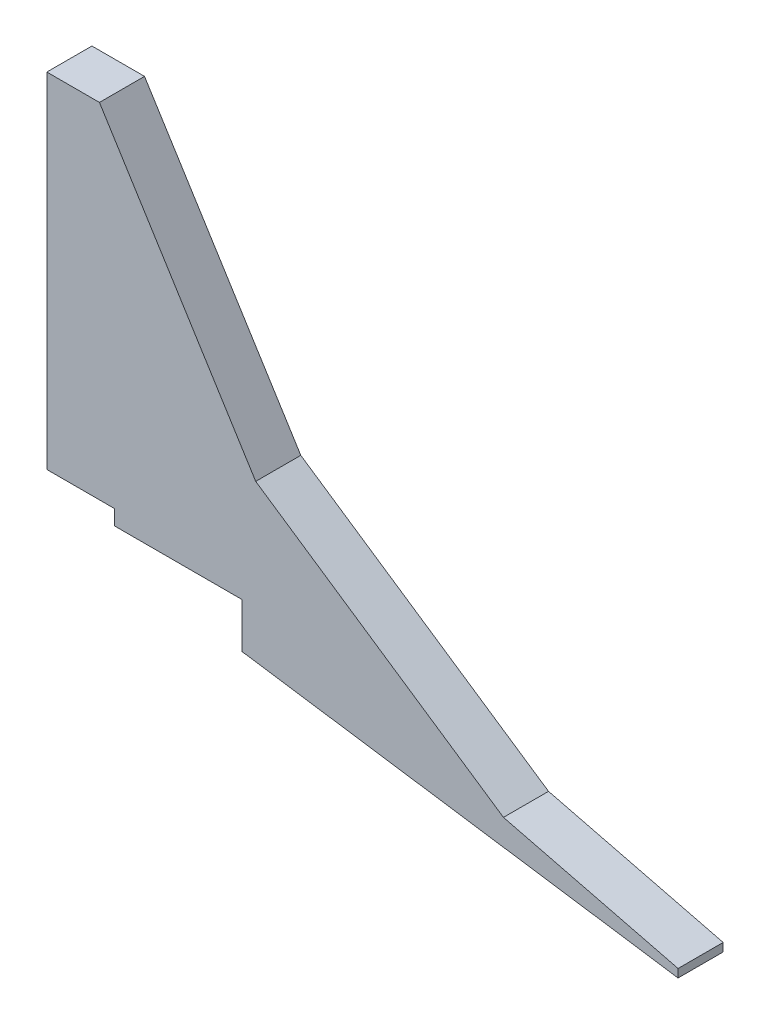
ISO-10303-21;
HEADER;
FILE_DESCRIPTION(('STEP AP214'),'2;1');
FILE_NAME('part.step','',(''),(''),'','','');
FILE_SCHEMA(('AUTOMOTIVE_DESIGN { 1 0 10303 214 1 1 1 1 }'));
ENDSEC;
DATA;
#1=APPLICATION_CONTEXT('core data for automotive mechanical design processes');
#2=APPLICATION_PROTOCOL_DEFINITION('international standard','automotive_design',2000,#1);
#3=PRODUCT_CONTEXT('',#1,'mechanical');
#4=PRODUCT('Part','Part','',(#3));
#5=PRODUCT_RELATED_PRODUCT_CATEGORY('part','',(#4));
#6=PRODUCT_DEFINITION_FORMATION('','',#4);
#7=PRODUCT_DEFINITION_CONTEXT('part definition',#1,'design');
#8=PRODUCT_DEFINITION('design','',#6,#7);
#9=PRODUCT_DEFINITION_SHAPE('','',#8);
#10=(LENGTH_UNIT() NAMED_UNIT(*) SI_UNIT(.MILLI.,.METRE.));
#11=(NAMED_UNIT(*) PLANE_ANGLE_UNIT() SI_UNIT($,.RADIAN.));
#12=(NAMED_UNIT(*) SI_UNIT($,.STERADIAN.) SOLID_ANGLE_UNIT());
#13=UNCERTAINTY_MEASURE_WITH_UNIT(LENGTH_MEASURE(1.E-05),#10,'distance_accuracy_value','');
#14=(GEOMETRIC_REPRESENTATION_CONTEXT(3) GLOBAL_UNCERTAINTY_ASSIGNED_CONTEXT((#13)) GLOBAL_UNIT_ASSIGNED_CONTEXT((#10,
#11,#12)) REPRESENTATION_CONTEXT('',''));
#15=CARTESIAN_POINT('',(0.,0.,0.));
#16=DIRECTION('',(0.,0.,1.));
#17=DIRECTION('',(1.,0.,0.));
#18=AXIS2_PLACEMENT_3D('',#15,#16,#17);
#19=CARTESIAN_POINT('',(94.5,11.,3.));
#20=DIRECTION('',(1.,0.,0.));
#21=DIRECTION('',(0.,0.,-1.));
#22=AXIS2_PLACEMENT_3D('',#19,#20,#21);
#23=PLANE('',#22);
#24=DIRECTION('',(0.,-1.,0.));
#25=VECTOR('',#24,1.);
#26=CARTESIAN_POINT('',(94.5,11.,0.));
#27=LINE('',#26,#25);
#28=CARTESIAN_POINT('',(94.5,11.,0.));
#29=VERTEX_POINT('',#28);
#30=CARTESIAN_POINT('',(94.5,10.,0.));
#31=VERTEX_POINT('',#30);
#32=EDGE_CURVE('E166',#29,#31,#27,.T.);
#33=ORIENTED_EDGE('',*,*,#32,.T.);
#34=DIRECTION('',(0.,0.,-1.));
#35=VECTOR('',#34,1.);
#36=CARTESIAN_POINT('',(94.5,10.,3.));
#37=LINE('',#36,#35);
#38=CARTESIAN_POINT('',(94.5,10.,3.));
#39=VERTEX_POINT('',#38);
#40=EDGE_CURVE('E11',#39,#31,#37,.T.);
#41=ORIENTED_EDGE('',*,*,#40,.F.);
#42=DIRECTION('',(0.,-1.,0.));
#43=VECTOR('',#42,1.);
#44=CARTESIAN_POINT('',(94.5,11.,3.));
#45=LINE('',#44,#43);
#46=CARTESIAN_POINT('',(94.5,11.,3.));
#47=VERTEX_POINT('',#46);
#48=EDGE_CURVE('E196',#47,#39,#45,.T.);
#49=ORIENTED_EDGE('',*,*,#48,.F.);
#50=DIRECTION('',(0.,0.,-1.));
#51=VECTOR('',#50,1.);
#52=CARTESIAN_POINT('',(94.5,11.,3.));
#53=LINE('',#52,#51);
#54=EDGE_CURVE('E162',#47,#29,#53,.T.);
#55=ORIENTED_EDGE('',*,*,#54,.T.);
#56=EDGE_LOOP('',(#33,#41,#49,#55));
#57=FACE_BOUND('',#56,.T.);
#58=ADVANCED_FACE('F45',(#57),#23,.F.);
#59=CARTESIAN_POINT('',(94.5,10.,3.));
#60=DIRECTION('',(0.,1.,0.));
#61=DIRECTION('',(0.,0.,1.));
#62=AXIS2_PLACEMENT_3D('',#59,#60,#61);
#63=PLANE('',#62);
#64=DIRECTION('',(1.,0.,0.));
#65=VECTOR('',#64,1.);
#66=CARTESIAN_POINT('',(94.5,10.,0.));
#67=LINE('',#66,#65);
#68=CARTESIAN_POINT('',(103.,10.,0.));
#69=VERTEX_POINT('',#68);
#70=EDGE_CURVE('E170',#31,#69,#67,.T.);
#71=ORIENTED_EDGE('',*,*,#70,.T.);
#72=DIRECTION('',(0.,0.,-1.));
#73=VECTOR('',#72,1.);
#74=CARTESIAN_POINT('',(103.,10.,3.));
#75=LINE('',#74,#73);
#76=CARTESIAN_POINT('',(103.,10.,3.));
#77=VERTEX_POINT('',#76);
#78=EDGE_CURVE('E54',#77,#69,#75,.T.);
#79=ORIENTED_EDGE('',*,*,#78,.F.);
#80=DIRECTION('',(1.,0.,0.));
#81=VECTOR('',#80,1.);
#82=CARTESIAN_POINT('',(94.5,10.,3.));
#83=LINE('',#82,#81);
#84=EDGE_CURVE('E114',#39,#77,#83,.T.);
#85=ORIENTED_EDGE('',*,*,#84,.F.);
#86=ORIENTED_EDGE('',*,*,#40,.T.);
#87=EDGE_LOOP('',(#71,#79,#85,#86));
#88=FACE_BOUND('',#87,.T.);
#89=ADVANCED_FACE('F281',(#88),#63,.F.);
#90=CARTESIAN_POINT('',(103.,10.,3.));
#91=DIRECTION('',(1.,0.,0.));
#92=DIRECTION('',(0.,0.,-1.));
#93=AXIS2_PLACEMENT_3D('',#90,#91,#92);
#94=PLANE('',#93);
#95=DIRECTION('',(0.,-1.,0.));
#96=VECTOR('',#95,1.);
#97=CARTESIAN_POINT('',(103.,10.,0.));
#98=LINE('',#97,#96);
#99=CARTESIAN_POINT('',(103.,7.,0.));
#100=VERTEX_POINT('',#99);
#101=EDGE_CURVE('E173',#69,#100,#98,.T.);
#102=ORIENTED_EDGE('',*,*,#101,.T.);
#103=DIRECTION('',(0.,0.,-1.));
#104=VECTOR('',#103,1.);
#105=CARTESIAN_POINT('',(103.,7.,3.));
#106=LINE('',#105,#104);
#107=CARTESIAN_POINT('',(103.,7.,3.));
#108=VERTEX_POINT('',#107);
#109=EDGE_CURVE('E219',#108,#100,#106,.T.);
#110=ORIENTED_EDGE('',*,*,#109,.F.);
#111=DIRECTION('',(0.,-1.,0.));
#112=VECTOR('',#111,1.);
#113=CARTESIAN_POINT('',(103.,10.,3.));
#114=LINE('',#113,#112);
#115=EDGE_CURVE('E229',#77,#108,#114,.T.);
#116=ORIENTED_EDGE('',*,*,#115,.F.);
#117=ORIENTED_EDGE('',*,*,#78,.T.);
#118=EDGE_LOOP('',(#102,#110,#116,#117));
#119=FACE_BOUND('',#118,.T.);
#120=ADVANCED_FACE('F227',(#119),#94,.F.);
#121=CARTESIAN_POINT('',(103.,7.,3.));
#122=DIRECTION('',(0.14667227947207,0.989185140625589,0.));
#123=DIRECTION('',(-0.989185140625589,0.14667227947207,0.));
#124=AXIS2_PLACEMENT_3D('',#121,#122,#123);
#125=PLANE('',#124);
#126=DIRECTION('',(0.989185140625589,-0.14667227947207,0.));
#127=VECTOR('',#126,1.);
#128=CARTESIAN_POINT('',(103.,7.,0.));
#129=LINE('',#128,#127);
#130=CARTESIAN_POINT('',(132.,2.7,0.));
#131=VERTEX_POINT('',#130);
#132=EDGE_CURVE('E176',#100,#131,#129,.T.);
#133=ORIENTED_EDGE('',*,*,#132,.T.);
#134=DIRECTION('',(0.,0.,-1.));
#135=VECTOR('',#134,1.);
#136=CARTESIAN_POINT('',(132.,2.7,3.));
#137=LINE('',#136,#135);
#138=CARTESIAN_POINT('',(132.,2.7,3.));
#139=VERTEX_POINT('',#138);
#140=EDGE_CURVE('E215',#139,#131,#137,.T.);
#141=ORIENTED_EDGE('',*,*,#140,.F.);
#142=DIRECTION('',(0.989185140625589,-0.14667227947207,0.));
#143=VECTOR('',#142,1.);
#144=CARTESIAN_POINT('',(103.,7.,3.));
#145=LINE('',#144,#143);
#146=EDGE_CURVE('E248',#108,#139,#145,.T.);
#147=ORIENTED_EDGE('',*,*,#146,.F.);
#148=ORIENTED_EDGE('',*,*,#109,.T.);
#149=EDGE_LOOP('',(#133,#141,#147,#148));
#150=FACE_BOUND('',#149,.T.);
#151=ADVANCED_FACE('F238',(#150),#125,.F.);
#152=CARTESIAN_POINT('',(132.,2.7,3.));
#153=DIRECTION('',(-1.,0.,0.));
#154=DIRECTION('',(0.,0.,1.));
#155=AXIS2_PLACEMENT_3D('',#152,#153,#154);
#156=PLANE('',#155);
#157=DIRECTION('',(0.,1.,0.));
#158=VECTOR('',#157,1.);
#159=CARTESIAN_POINT('',(132.,2.7,0.));
#160=LINE('',#159,#158);
#161=CARTESIAN_POINT('',(132.,3.249,0.));
#162=VERTEX_POINT('',#161);
#163=EDGE_CURVE('E179',#131,#162,#160,.T.);
#164=ORIENTED_EDGE('',*,*,#163,.T.);
#165=DIRECTION('',(0.,0.,-1.));
#166=VECTOR('',#165,1.);
#167=CARTESIAN_POINT('',(132.,3.249,3.));
#168=LINE('',#167,#166);
#169=CARTESIAN_POINT('',(132.,3.249,3.));
#170=VERTEX_POINT('',#169);
#171=EDGE_CURVE('E211',#170,#162,#168,.T.);
#172=ORIENTED_EDGE('',*,*,#171,.F.);
#173=DIRECTION('',(0.,1.,0.));
#174=VECTOR('',#173,1.);
#175=CARTESIAN_POINT('',(132.,2.7,3.));
#176=LINE('',#175,#174);
#177=EDGE_CURVE('E244',#139,#170,#176,.T.);
#178=ORIENTED_EDGE('',*,*,#177,.F.);
#179=ORIENTED_EDGE('',*,*,#140,.T.);
#180=EDGE_LOOP('',(#164,#172,#178,#179));
#181=FACE_BOUND('',#180,.T.);
#182=ADVANCED_FACE('F242',(#181),#156,.F.);
#183=CARTESIAN_POINT('',(132.,3.249,3.));
#184=DIRECTION('',(-0.241898626886626,-0.970301527521401,0.));
#185=DIRECTION('',(0.970301527521402,-0.241898626886626,0.));
#186=AXIS2_PLACEMENT_3D('',#183,#184,#185);
#187=PLANE('',#186);
#188=DIRECTION('',(-0.970301527521401,0.241898626886626,0.));
#189=VECTOR('',#188,1.);
#190=CARTESIAN_POINT('',(132.,3.249,0.));
#191=LINE('',#190,#189);
#192=CARTESIAN_POINT('',(120.380483,6.145775,0.));
#193=VERTEX_POINT('',#192);
#194=EDGE_CURVE('E182',#162,#193,#191,.T.);
#195=ORIENTED_EDGE('',*,*,#194,.T.);
#196=DIRECTION('',(0.,0.,-1.));
#197=VECTOR('',#196,1.);
#198=CARTESIAN_POINT('',(120.380483,6.145775,3.));
#199=LINE('',#198,#197);
#200=CARTESIAN_POINT('',(120.380483,6.145775,3.));
#201=VERTEX_POINT('',#200);
#202=EDGE_CURVE('E207',#201,#193,#199,.T.);
#203=ORIENTED_EDGE('',*,*,#202,.F.);
#204=DIRECTION('',(-0.970301527521401,0.241898626886626,0.));
#205=VECTOR('',#204,1.);
#206=CARTESIAN_POINT('',(132.,3.249,3.));
#207=LINE('',#206,#205);
#208=EDGE_CURVE('E247',#170,#201,#207,.T.);
#209=ORIENTED_EDGE('',*,*,#208,.F.);
#210=ORIENTED_EDGE('',*,*,#171,.T.);
#211=EDGE_LOOP('',(#195,#203,#209,#210));
#212=FACE_BOUND('',#211,.T.);
#213=ADVANCED_FACE('F292',(#212),#187,.F.);
#214=CARTESIAN_POINT('',(120.380483,6.145775,3.));
#215=DIRECTION('',(-0.559192895201916,-0.829037578132439,0.));
#216=DIRECTION('',(0.829037578132439,-0.559192895201916,0.));
#217=AXIS2_PLACEMENT_3D('',#214,#215,#216);
#218=PLANE('',#217);
#219=DIRECTION('',(-0.829037578132439,0.559192895201916,0.));
#220=VECTOR('',#219,1.);
#221=CARTESIAN_POINT('',(120.380483,6.145775,0.));
#222=LINE('',#221,#220);
#223=CARTESIAN_POINT('',(103.896885,17.264102,0.));
#224=VERTEX_POINT('',#223);
#225=EDGE_CURVE('E184',#193,#224,#222,.T.);
#226=ORIENTED_EDGE('',*,*,#225,.T.);
#227=DIRECTION('',(0.,0.,-1.));
#228=VECTOR('',#227,1.);
#229=CARTESIAN_POINT('',(103.896885,17.264102,3.));
#230=LINE('',#229,#228);
#231=CARTESIAN_POINT('',(103.896885,17.264102,3.));
#232=VERTEX_POINT('',#231);
#233=EDGE_CURVE('E203',#232,#224,#230,.T.);
#234=ORIENTED_EDGE('',*,*,#233,.F.);
#235=DIRECTION('',(-0.829037578132439,0.559192895201916,0.));
#236=VECTOR('',#235,1.);
#237=CARTESIAN_POINT('',(120.380483,6.145775,3.));
#238=LINE('',#237,#236);
#239=EDGE_CURVE('E251',#201,#232,#238,.T.);
#240=ORIENTED_EDGE('',*,*,#239,.F.);
#241=ORIENTED_EDGE('',*,*,#202,.T.);
#242=EDGE_LOOP('',(#226,#234,#240,#241));
#243=FACE_BOUND('',#242,.T.);
#244=ADVANCED_FACE('F263',(#243),#218,.F.);
#245=CARTESIAN_POINT('',(103.896885,17.264102,3.));
#246=DIRECTION('',(-0.848048152549454,-0.529919173985484,0.));
#247=DIRECTION('',(0.529919173985484,-0.848048152549454,0.));
#248=AXIS2_PLACEMENT_3D('',#245,#246,#247);
#249=PLANE('',#248);
#250=DIRECTION('',(-0.529919173985484,0.848048152549454,0.));
#251=VECTOR('',#250,1.);
#252=CARTESIAN_POINT('',(103.896885,17.264102,0.));
#253=LINE('',#252,#251);
#254=CARTESIAN_POINT('',(93.5,33.9026,0.));
#255=VERTEX_POINT('',#254);
#256=EDGE_CURVE('E187',#224,#255,#253,.T.);
#257=ORIENTED_EDGE('',*,*,#256,.T.);
#258=DIRECTION('',(0.,0.,-1.));
#259=VECTOR('',#258,1.);
#260=CARTESIAN_POINT('',(93.5,33.9026,3.));
#261=LINE('',#260,#259);
#262=CARTESIAN_POINT('',(93.5,33.9026,3.));
#263=VERTEX_POINT('',#262);
#264=EDGE_CURVE('E153',#263,#255,#261,.T.);
#265=ORIENTED_EDGE('',*,*,#264,.F.);
#266=DIRECTION('',(-0.529919173985484,0.848048152549454,0.));
#267=VECTOR('',#266,1.);
#268=CARTESIAN_POINT('',(103.896885,17.264102,3.));
#269=LINE('',#268,#267);
#270=EDGE_CURVE('E142',#232,#263,#269,.T.);
#271=ORIENTED_EDGE('',*,*,#270,.F.);
#272=ORIENTED_EDGE('',*,*,#233,.T.);
#273=EDGE_LOOP('',(#257,#265,#271,#272));
#274=FACE_BOUND('',#273,.T.);
#275=ADVANCED_FACE('F267',(#274),#249,.F.);
#276=CARTESIAN_POINT('',(93.5,33.9026,3.));
#277=DIRECTION('',(0.,-1.,0.));
#278=DIRECTION('',(0.,0.,-1.));
#279=AXIS2_PLACEMENT_3D('',#276,#277,#278);
#280=PLANE('',#279);
#281=DIRECTION('',(-1.,0.,0.));
#282=VECTOR('',#281,1.);
#283=CARTESIAN_POINT('',(93.5,33.9026,0.));
#284=LINE('',#283,#282);
#285=CARTESIAN_POINT('',(90.,33.9026,0.));
#286=VERTEX_POINT('',#285);
#287=EDGE_CURVE('E151',#255,#286,#284,.T.);
#288=ORIENTED_EDGE('',*,*,#287,.T.);
#289=DIRECTION('',(0.,0.,-1.));
#290=VECTOR('',#289,1.);
#291=CARTESIAN_POINT('',(90.,33.9026,3.));
#292=LINE('',#291,#290);
#293=CARTESIAN_POINT('',(90.,33.9026,3.));
#294=VERTEX_POINT('',#293);
#295=EDGE_CURVE('E148',#294,#286,#292,.T.);
#296=ORIENTED_EDGE('',*,*,#295,.F.);
#297=DIRECTION('',(-1.,0.,0.));
#298=VECTOR('',#297,1.);
#299=CARTESIAN_POINT('',(93.5,33.9026,3.));
#300=LINE('',#299,#298);
#301=EDGE_CURVE('E136',#263,#294,#300,.T.);
#302=ORIENTED_EDGE('',*,*,#301,.F.);
#303=ORIENTED_EDGE('',*,*,#264,.T.);
#304=EDGE_LOOP('',(#288,#296,#302,#303));
#305=FACE_BOUND('',#304,.T.);
#306=ADVANCED_FACE('F149',(#305),#280,.F.);
#307=CARTESIAN_POINT('',(90.,33.9026,3.));
#308=DIRECTION('',(1.,0.,0.));
#309=DIRECTION('',(0.,0.,-1.));
#310=AXIS2_PLACEMENT_3D('',#307,#308,#309);
#311=PLANE('',#310);
#312=DIRECTION('',(0.,-1.,0.));
#313=VECTOR('',#312,1.);
#314=CARTESIAN_POINT('',(90.,33.9026,0.));
#315=LINE('',#314,#313);
#316=CARTESIAN_POINT('',(90.,11.,0.));
#317=VERTEX_POINT('',#316);
#318=EDGE_CURVE('E100',#286,#317,#315,.T.);
#319=ORIENTED_EDGE('',*,*,#318,.T.);
#320=DIRECTION('',(0.,0.,-1.));
#321=VECTOR('',#320,1.);
#322=CARTESIAN_POINT('',(90.,11.,3.));
#323=LINE('',#322,#321);
#324=CARTESIAN_POINT('',(90.,11.,3.));
#325=VERTEX_POINT('',#324);
#326=EDGE_CURVE('E154',#325,#317,#323,.T.);
#327=ORIENTED_EDGE('',*,*,#326,.F.);
#328=DIRECTION('',(0.,-1.,0.));
#329=VECTOR('',#328,1.);
#330=CARTESIAN_POINT('',(90.,33.9026,3.));
#331=LINE('',#330,#329);
#332=EDGE_CURVE('E140',#294,#325,#331,.T.);
#333=ORIENTED_EDGE('',*,*,#332,.F.);
#334=ORIENTED_EDGE('',*,*,#295,.T.);
#335=EDGE_LOOP('',(#319,#327,#333,#334));
#336=FACE_BOUND('',#335,.T.);
#337=ADVANCED_FACE('F156',(#336),#311,.F.);
#338=CARTESIAN_POINT('',(90.,11.,3.));
#339=DIRECTION('',(0.,1.,0.));
#340=DIRECTION('',(0.,0.,1.));
#341=AXIS2_PLACEMENT_3D('',#338,#339,#340);
#342=PLANE('',#341);
#343=DIRECTION('',(1.,0.,0.));
#344=VECTOR('',#343,1.);
#345=CARTESIAN_POINT('',(90.,11.,0.));
#346=LINE('',#345,#344);
#347=EDGE_CURVE('E106',#317,#29,#346,.T.);
#348=ORIENTED_EDGE('',*,*,#347,.T.);
#349=ORIENTED_EDGE('',*,*,#54,.F.);
#350=DIRECTION('',(1.,0.,0.));
#351=VECTOR('',#350,1.);
#352=CARTESIAN_POINT('',(90.,11.,3.));
#353=LINE('',#352,#351);
#354=EDGE_CURVE('E62',#325,#47,#353,.T.);
#355=ORIENTED_EDGE('',*,*,#354,.F.);
#356=ORIENTED_EDGE('',*,*,#326,.T.);
#357=EDGE_LOOP('',(#348,#349,#355,#356));
#358=FACE_BOUND('',#357,.T.);
#359=ADVANCED_FACE('F271',(#358),#342,.F.);
#360=CARTESIAN_POINT('',(0.,0.,3.));
#361=DIRECTION('',(0.,0.,1.));
#362=DIRECTION('',(1.,0.,0.));
#363=AXIS2_PLACEMENT_3D('',#360,#361,#362);
#364=PLANE('',#363);
#365=ORIENTED_EDGE('',*,*,#48,.T.);
#366=ORIENTED_EDGE('',*,*,#84,.T.);
#367=ORIENTED_EDGE('',*,*,#115,.T.);
#368=ORIENTED_EDGE('',*,*,#146,.T.);
#369=ORIENTED_EDGE('',*,*,#177,.T.);
#370=ORIENTED_EDGE('',*,*,#208,.T.);
#371=ORIENTED_EDGE('',*,*,#239,.T.);
#372=ORIENTED_EDGE('',*,*,#270,.T.);
#373=ORIENTED_EDGE('',*,*,#301,.T.);
#374=ORIENTED_EDGE('',*,*,#332,.T.);
#375=ORIENTED_EDGE('',*,*,#354,.T.);
#376=EDGE_LOOP('',(#365,#366,#367,#368,#369,#370,#371,#372,#373,#374,#375));
#377=FACE_BOUND('',#376,.T.);
#378=ADVANCED_FACE('F138',(#377),#364,.T.);
#379=CARTESIAN_POINT('',(0.,0.,0.));
#380=DIRECTION('',(0.,0.,1.));
#381=DIRECTION('',(1.,0.,0.));
#382=AXIS2_PLACEMENT_3D('',#379,#380,#381);
#383=PLANE('',#382);
#384=ORIENTED_EDGE('',*,*,#32,.F.);
#385=ORIENTED_EDGE('',*,*,#347,.F.);
#386=ORIENTED_EDGE('',*,*,#318,.F.);
#387=ORIENTED_EDGE('',*,*,#287,.F.);
#388=ORIENTED_EDGE('',*,*,#256,.F.);
#389=ORIENTED_EDGE('',*,*,#225,.F.);
#390=ORIENTED_EDGE('',*,*,#194,.F.);
#391=ORIENTED_EDGE('',*,*,#163,.F.);
#392=ORIENTED_EDGE('',*,*,#132,.F.);
#393=ORIENTED_EDGE('',*,*,#101,.F.);
#394=ORIENTED_EDGE('',*,*,#70,.F.);
#395=EDGE_LOOP('',(#384,#385,#386,#387,#388,#389,#390,#391,#392,#393,#394));
#396=FACE_BOUND('',#395,.T.);
#397=ADVANCED_FACE('F233',(#396),#383,.F.);
#398=CLOSED_SHELL('',(#58,#89,#120,#151,#182,#213,#244,#275,#306,#337,#359,#378,#397));
#399=MANIFOLD_SOLID_BREP('B2',#398);
#400=ADVANCED_BREP_SHAPE_REPRESENTATION('',(#18,#399),#14);
#401=SHAPE_DEFINITION_REPRESENTATION(#9,#400);
ENDSEC;
END-ISO-10303-21;
